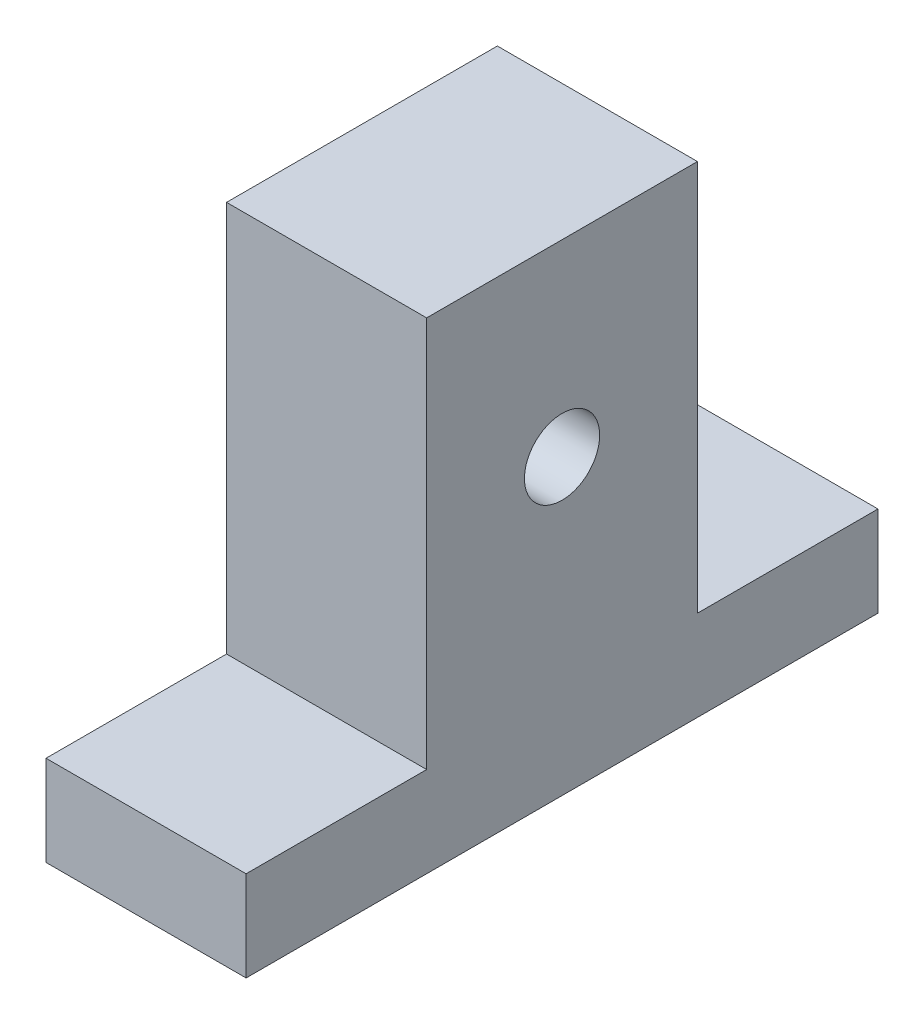
ISO-10303-21;
HEADER;
FILE_DESCRIPTION(('STEP AP214'),'2;1');
FILE_NAME('part.step','',(''),(''),'','','');
FILE_SCHEMA(('AUTOMOTIVE_DESIGN { 1 0 10303 214 1 1 1 1 }'));
ENDSEC;
DATA;
#1=APPLICATION_CONTEXT('core data for automotive mechanical design processes');
#2=APPLICATION_PROTOCOL_DEFINITION('international standard','automotive_design',2000,#1);
#3=PRODUCT_CONTEXT('',#1,'mechanical');
#4=PRODUCT('Part','Part','',(#3));
#5=PRODUCT_RELATED_PRODUCT_CATEGORY('part','',(#4));
#6=PRODUCT_DEFINITION_FORMATION('','',#4);
#7=PRODUCT_DEFINITION_CONTEXT('part definition',#1,'design');
#8=PRODUCT_DEFINITION('design','',#6,#7);
#9=PRODUCT_DEFINITION_SHAPE('','',#8);
#10=(LENGTH_UNIT() NAMED_UNIT(*) SI_UNIT(.MILLI.,.METRE.));
#11=(NAMED_UNIT(*) PLANE_ANGLE_UNIT() SI_UNIT($,.RADIAN.));
#12=(NAMED_UNIT(*) SI_UNIT($,.STERADIAN.) SOLID_ANGLE_UNIT());
#13=UNCERTAINTY_MEASURE_WITH_UNIT(LENGTH_MEASURE(1.E-05),#10,'distance_accuracy_value','');
#14=(GEOMETRIC_REPRESENTATION_CONTEXT(3) GLOBAL_UNCERTAINTY_ASSIGNED_CONTEXT((#13)) GLOBAL_UNIT_ASSIGNED_CONTEXT((#10,
#11,#12)) REPRESENTATION_CONTEXT('',''));
#15=CARTESIAN_POINT('',(0.,0.,0.));
#16=DIRECTION('',(0.,0.,1.));
#17=DIRECTION('',(1.,0.,0.));
#18=AXIS2_PLACEMENT_3D('',#15,#16,#17);
#19=CARTESIAN_POINT('',(13.3,0.,0.));
#20=DIRECTION('',(1.,0.,0.));
#21=DIRECTION('',(0.,0.,-1.));
#22=AXIS2_PLACEMENT_3D('',#19,#20,#21);
#23=PLANE('',#22);
#24=DIRECTION('',(0.,-1.,0.));
#25=VECTOR('',#24,1.);
#26=CARTESIAN_POINT('',(13.3,-84.4346273183229,73.8395149534096));
#27=LINE('',#26,#25);
#28=CARTESIAN_POINT('',(13.3,-84.4346273183229,73.8395149534096));
#29=VERTEX_POINT('',#28);
#30=CARTESIAN_POINT('',(13.3,-90.4346273183229,73.8395149534096));
#31=VERTEX_POINT('',#30);
#32=EDGE_CURVE('E153',#29,#31,#27,.T.);
#33=ORIENTED_EDGE('',*,*,#32,.T.);
#34=DIRECTION('',(0.,0.,-1.));
#35=VECTOR('',#34,1.);
#36=CARTESIAN_POINT('',(13.3,-90.4346273183229,73.8395149534096));
#37=LINE('',#36,#35);
#38=CARTESIAN_POINT('',(13.3,-90.4346273183229,31.8395149534096));
#39=VERTEX_POINT('',#38);
#40=EDGE_CURVE('E101',#31,#39,#37,.T.);
#41=ORIENTED_EDGE('',*,*,#40,.T.);
#42=DIRECTION('',(0.,1.,0.));
#43=VECTOR('',#42,1.);
#44=CARTESIAN_POINT('',(13.3,-90.4346273183229,31.8395149534096));
#45=LINE('',#44,#43);
#46=CARTESIAN_POINT('',(13.3,-84.4346273183229,31.8395149534096));
#47=VERTEX_POINT('',#46);
#48=EDGE_CURVE('E169',#39,#47,#45,.T.);
#49=ORIENTED_EDGE('',*,*,#48,.T.);
#50=DIRECTION('',(0.,0.,1.));
#51=VECTOR('',#50,1.);
#52=CARTESIAN_POINT('',(13.3,-84.4346273183229,31.8395149534096));
#53=LINE('',#52,#51);
#54=CARTESIAN_POINT('',(13.3,-84.4346273183229,43.8395149534096));
#55=VERTEX_POINT('',#54);
#56=EDGE_CURVE('E182',#47,#55,#53,.T.);
#57=ORIENTED_EDGE('',*,*,#56,.T.);
#58=DIRECTION('',(0.,1.,0.));
#59=VECTOR('',#58,1.);
#60=CARTESIAN_POINT('',(13.3,-84.4346273183229,43.8395149534096));
#61=LINE('',#60,#59);
#62=CARTESIAN_POINT('',(13.3,-58.4346273183229,43.8395149534096));
#63=VERTEX_POINT('',#62);
#64=EDGE_CURVE('E116',#55,#63,#61,.T.);
#65=ORIENTED_EDGE('',*,*,#64,.T.);
#66=DIRECTION('',(0.,0.,1.));
#67=VECTOR('',#66,1.);
#68=CARTESIAN_POINT('',(13.3,-58.4346273183229,43.8395149534096));
#69=LINE('',#68,#67);
#70=CARTESIAN_POINT('',(13.3,-58.4346273183229,61.8395149534097));
#71=VERTEX_POINT('',#70);
#72=EDGE_CURVE('E111',#63,#71,#69,.T.);
#73=ORIENTED_EDGE('',*,*,#72,.T.);
#74=DIRECTION('',(0.,-1.,0.));
#75=VECTOR('',#74,1.);
#76=CARTESIAN_POINT('',(13.3,-58.4346273183229,61.8395149534097));
#77=LINE('',#76,#75);
#78=CARTESIAN_POINT('',(13.3,-84.4346273183229,61.8395149534097));
#79=VERTEX_POINT('',#78);
#80=EDGE_CURVE('E117',#71,#79,#77,.T.);
#81=ORIENTED_EDGE('',*,*,#80,.T.);
#82=DIRECTION('',(0.,0.,1.));
#83=VECTOR('',#82,1.);
#84=CARTESIAN_POINT('',(13.3,-84.4346273183229,61.8395149534097));
#85=LINE('',#84,#83);
#86=EDGE_CURVE('E59',#79,#29,#85,.T.);
#87=ORIENTED_EDGE('',*,*,#86,.T.);
#88=EDGE_LOOP('',(#33,#41,#49,#57,#65,#73,#81,#87));
#89=FACE_BOUND('',#88,.T.);
#90=CARTESIAN_POINT('',(13.3,-70.9346273183229,52.8395149534096));
#91=DIRECTION('',(1.,0.,0.));
#92=DIRECTION('',(0.,0.,-1.));
#93=AXIS2_PLACEMENT_3D('',#90,#91,#92);
#94=CIRCLE('',#93,2.5);
#95=CARTESIAN_POINT('',(13.3,-70.9346273183229,50.3395149534096));
#96=VERTEX_POINT('',#95);
#97=EDGE_CURVE('E142',#96,#96,#94,.T.);
#98=ORIENTED_EDGE('',*,*,#97,.F.);
#99=EDGE_LOOP('',(#98));
#100=FACE_BOUND('',#99,.T.);
#101=ADVANCED_FACE('F41',(#89,#100),#23,.T.);
#102=CARTESIAN_POINT('',(0.,0.,0.));
#103=DIRECTION('',(1.,0.,0.));
#104=DIRECTION('',(0.,0.,-1.));
#105=AXIS2_PLACEMENT_3D('',#102,#103,#104);
#106=PLANE('',#105);
#107=DIRECTION('',(0.,-1.,0.));
#108=VECTOR('',#107,1.);
#109=CARTESIAN_POINT('',(0.,-84.4346273183229,73.8395149534096));
#110=LINE('',#109,#108);
#111=CARTESIAN_POINT('',(0.,-84.4346273183229,73.8395149534096));
#112=VERTEX_POINT('',#111);
#113=CARTESIAN_POINT('',(0.,-90.4346273183229,73.8395149534096));
#114=VERTEX_POINT('',#113);
#115=EDGE_CURVE('E138',#112,#114,#110,.T.);
#116=ORIENTED_EDGE('',*,*,#115,.F.);
#117=DIRECTION('',(0.,0.,1.));
#118=VECTOR('',#117,1.);
#119=CARTESIAN_POINT('',(0.,-84.4346273183229,61.8395149534097));
#120=LINE('',#119,#118);
#121=CARTESIAN_POINT('',(0.,-84.4346273183229,61.8395149534097));
#122=VERTEX_POINT('',#121);
#123=EDGE_CURVE('E91',#122,#112,#120,.T.);
#124=ORIENTED_EDGE('',*,*,#123,.F.);
#125=DIRECTION('',(0.,-1.,0.));
#126=VECTOR('',#125,1.);
#127=CARTESIAN_POINT('',(0.,-58.4346273183229,61.8395149534097));
#128=LINE('',#127,#126);
#129=CARTESIAN_POINT('',(0.,-58.4346273183229,61.8395149534097));
#130=VERTEX_POINT('',#129);
#131=EDGE_CURVE('E87',#130,#122,#128,.T.);
#132=ORIENTED_EDGE('',*,*,#131,.F.);
#133=DIRECTION('',(0.,0.,1.));
#134=VECTOR('',#133,1.);
#135=CARTESIAN_POINT('',(0.,-58.4346273183229,43.8395149534096));
#136=LINE('',#135,#134);
#137=CARTESIAN_POINT('',(0.,-58.4346273183229,43.8395149534096));
#138=VERTEX_POINT('',#137);
#139=EDGE_CURVE('E126',#138,#130,#136,.T.);
#140=ORIENTED_EDGE('',*,*,#139,.F.);
#141=DIRECTION('',(0.,1.,0.));
#142=VECTOR('',#141,1.);
#143=CARTESIAN_POINT('',(0.,-84.4346273183229,43.8395149534096));
#144=LINE('',#143,#142);
#145=CARTESIAN_POINT('',(0.,-84.4346273183229,43.8395149534096));
#146=VERTEX_POINT('',#145);
#147=EDGE_CURVE('E146',#146,#138,#144,.T.);
#148=ORIENTED_EDGE('',*,*,#147,.F.);
#149=DIRECTION('',(0.,0.,1.));
#150=VECTOR('',#149,1.);
#151=CARTESIAN_POINT('',(0.,-84.4346273183229,31.8395149534096));
#152=LINE('',#151,#150);
#153=CARTESIAN_POINT('',(0.,-84.4346273183229,31.8395149534096));
#154=VERTEX_POINT('',#153);
#155=EDGE_CURVE('E148',#154,#146,#152,.T.);
#156=ORIENTED_EDGE('',*,*,#155,.F.);
#157=DIRECTION('',(0.,1.,0.));
#158=VECTOR('',#157,1.);
#159=CARTESIAN_POINT('',(0.,-90.4346273183229,31.8395149534096));
#160=LINE('',#159,#158);
#161=CARTESIAN_POINT('',(0.,-90.4346273183229,31.8395149534096));
#162=VERTEX_POINT('',#161);
#163=EDGE_CURVE('E145',#162,#154,#160,.T.);
#164=ORIENTED_EDGE('',*,*,#163,.F.);
#165=DIRECTION('',(0.,0.,-1.));
#166=VECTOR('',#165,1.);
#167=CARTESIAN_POINT('',(0.,-90.4346273183229,73.8395149534096));
#168=LINE('',#167,#166);
#169=EDGE_CURVE('E143',#114,#162,#168,.T.);
#170=ORIENTED_EDGE('',*,*,#169,.F.);
#171=EDGE_LOOP('',(#116,#124,#132,#140,#148,#156,#164,#170));
#172=FACE_BOUND('',#171,.T.);
#173=CARTESIAN_POINT('',(0.,-70.9346273183229,52.8395149534096));
#174=DIRECTION('',(1.,0.,0.));
#175=DIRECTION('',(0.,0.,-1.));
#176=AXIS2_PLACEMENT_3D('',#173,#174,#175);
#177=CIRCLE('',#176,2.5);
#178=CARTESIAN_POINT('',(0.,-70.9346273183229,50.3395149534096));
#179=VERTEX_POINT('',#178);
#180=EDGE_CURVE('E190',#179,#179,#177,.T.);
#181=ORIENTED_EDGE('',*,*,#180,.T.);
#182=EDGE_LOOP('',(#181));
#183=FACE_BOUND('',#182,.T.);
#184=ADVANCED_FACE('F174',(#172,#183),#106,.F.);
#185=CARTESIAN_POINT('',(13.3,-84.4346273183229,73.8395149534096));
#186=DIRECTION('',(0.,0.,-1.));
#187=DIRECTION('',(-1.,0.,0.));
#188=AXIS2_PLACEMENT_3D('',#185,#186,#187);
#189=PLANE('',#188);
#190=ORIENTED_EDGE('',*,*,#115,.T.);
#191=DIRECTION('',(-1.,0.,0.));
#192=VECTOR('',#191,1.);
#193=CARTESIAN_POINT('',(13.3,-90.4346273183229,73.8395149534096));
#194=LINE('',#193,#192);
#195=EDGE_CURVE('E11',#31,#114,#194,.T.);
#196=ORIENTED_EDGE('',*,*,#195,.F.);
#197=ORIENTED_EDGE('',*,*,#32,.F.);
#198=DIRECTION('',(-1.,0.,0.));
#199=VECTOR('',#198,1.);
#200=CARTESIAN_POINT('',(13.3,-84.4346273183229,73.8395149534096));
#201=LINE('',#200,#199);
#202=EDGE_CURVE('E133',#29,#112,#201,.T.);
#203=ORIENTED_EDGE('',*,*,#202,.T.);
#204=EDGE_LOOP('',(#190,#196,#197,#203));
#205=FACE_BOUND('',#204,.T.);
#206=ADVANCED_FACE('F43',(#205),#189,.F.);
#207=CARTESIAN_POINT('',(13.3,-90.4346273183229,73.8395149534096));
#208=DIRECTION('',(0.,1.,0.));
#209=DIRECTION('',(0.,0.,1.));
#210=AXIS2_PLACEMENT_3D('',#207,#208,#209);
#211=PLANE('',#210);
#212=ORIENTED_EDGE('',*,*,#169,.T.);
#213=DIRECTION('',(-1.,0.,0.));
#214=VECTOR('',#213,1.);
#215=CARTESIAN_POINT('',(13.3,-90.4346273183229,31.8395149534096));
#216=LINE('',#215,#214);
#217=EDGE_CURVE('E49',#39,#162,#216,.T.);
#218=ORIENTED_EDGE('',*,*,#217,.F.);
#219=ORIENTED_EDGE('',*,*,#40,.F.);
#220=ORIENTED_EDGE('',*,*,#195,.T.);
#221=EDGE_LOOP('',(#212,#218,#219,#220));
#222=FACE_BOUND('',#221,.T.);
#223=ADVANCED_FACE('F214',(#222),#211,.F.);
#224=CARTESIAN_POINT('',(13.3,-90.4346273183229,31.8395149534096));
#225=DIRECTION('',(0.,0.,1.));
#226=DIRECTION('',(1.,0.,0.));
#227=AXIS2_PLACEMENT_3D('',#224,#225,#226);
#228=PLANE('',#227);
#229=ORIENTED_EDGE('',*,*,#163,.T.);
#230=DIRECTION('',(-1.,0.,0.));
#231=VECTOR('',#230,1.);
#232=CARTESIAN_POINT('',(13.3,-84.4346273183229,31.8395149534096));
#233=LINE('',#232,#231);
#234=EDGE_CURVE('E159',#47,#154,#233,.T.);
#235=ORIENTED_EDGE('',*,*,#234,.F.);
#236=ORIENTED_EDGE('',*,*,#48,.F.);
#237=ORIENTED_EDGE('',*,*,#217,.T.);
#238=EDGE_LOOP('',(#229,#235,#236,#237));
#239=FACE_BOUND('',#238,.T.);
#240=ADVANCED_FACE('F167',(#239),#228,.F.);
#241=CARTESIAN_POINT('',(13.3,-84.4346273183229,31.8395149534096));
#242=DIRECTION('',(0.,-1.,0.));
#243=DIRECTION('',(0.,0.,-1.));
#244=AXIS2_PLACEMENT_3D('',#241,#242,#243);
#245=PLANE('',#244);
#246=ORIENTED_EDGE('',*,*,#155,.T.);
#247=DIRECTION('',(-1.,0.,0.));
#248=VECTOR('',#247,1.);
#249=CARTESIAN_POINT('',(13.3,-84.4346273183229,43.8395149534096));
#250=LINE('',#249,#248);
#251=EDGE_CURVE('E160',#55,#146,#250,.T.);
#252=ORIENTED_EDGE('',*,*,#251,.F.);
#253=ORIENTED_EDGE('',*,*,#56,.F.);
#254=ORIENTED_EDGE('',*,*,#234,.T.);
#255=EDGE_LOOP('',(#246,#252,#253,#254));
#256=FACE_BOUND('',#255,.T.);
#257=ADVANCED_FACE('F180',(#256),#245,.F.);
#258=CARTESIAN_POINT('',(13.3,-84.4346273183229,43.8395149534096));
#259=DIRECTION('',(0.,0.,1.));
#260=DIRECTION('',(1.,0.,0.));
#261=AXIS2_PLACEMENT_3D('',#258,#259,#260);
#262=PLANE('',#261);
#263=ORIENTED_EDGE('',*,*,#147,.T.);
#264=DIRECTION('',(-1.,0.,0.));
#265=VECTOR('',#264,1.);
#266=CARTESIAN_POINT('',(13.3,-58.4346273183229,43.8395149534096));
#267=LINE('',#266,#265);
#268=EDGE_CURVE('E129',#63,#138,#267,.T.);
#269=ORIENTED_EDGE('',*,*,#268,.F.);
#270=ORIENTED_EDGE('',*,*,#64,.F.);
#271=ORIENTED_EDGE('',*,*,#251,.T.);
#272=EDGE_LOOP('',(#263,#269,#270,#271));
#273=FACE_BOUND('',#272,.T.);
#274=ADVANCED_FACE('F179',(#273),#262,.F.);
#275=CARTESIAN_POINT('',(13.3,-58.4346273183229,43.8395149534096));
#276=DIRECTION('',(0.,-1.,0.));
#277=DIRECTION('',(0.,0.,-1.));
#278=AXIS2_PLACEMENT_3D('',#275,#276,#277);
#279=PLANE('',#278);
#280=ORIENTED_EDGE('',*,*,#139,.T.);
#281=DIRECTION('',(-1.,0.,0.));
#282=VECTOR('',#281,1.);
#283=CARTESIAN_POINT('',(13.3,-58.4346273183229,61.8395149534097));
#284=LINE('',#283,#282);
#285=EDGE_CURVE('E124',#71,#130,#284,.T.);
#286=ORIENTED_EDGE('',*,*,#285,.F.);
#287=ORIENTED_EDGE('',*,*,#72,.F.);
#288=ORIENTED_EDGE('',*,*,#268,.T.);
#289=EDGE_LOOP('',(#280,#286,#287,#288));
#290=FACE_BOUND('',#289,.T.);
#291=ADVANCED_FACE('F127',(#290),#279,.F.);
#292=CARTESIAN_POINT('',(13.3,-58.4346273183229,61.8395149534097));
#293=DIRECTION('',(0.,0.,-1.));
#294=DIRECTION('',(0.,1.,0.));
#295=AXIS2_PLACEMENT_3D('',#292,#293,#294);
#296=PLANE('',#295);
#297=ORIENTED_EDGE('',*,*,#131,.T.);
#298=DIRECTION('',(-1.,0.,0.));
#299=VECTOR('',#298,1.);
#300=CARTESIAN_POINT('',(13.3,-84.4346273183229,61.8395149534097));
#301=LINE('',#300,#299);
#302=EDGE_CURVE('E128',#79,#122,#301,.T.);
#303=ORIENTED_EDGE('',*,*,#302,.F.);
#304=ORIENTED_EDGE('',*,*,#80,.F.);
#305=ORIENTED_EDGE('',*,*,#285,.T.);
#306=EDGE_LOOP('',(#297,#303,#304,#305));
#307=FACE_BOUND('',#306,.T.);
#308=ADVANCED_FACE('F135',(#307),#296,.F.);
#309=CARTESIAN_POINT('',(13.3,-84.4346273183229,61.8395149534097));
#310=DIRECTION('',(0.,-1.,0.));
#311=DIRECTION('',(0.,0.,-1.));
#312=AXIS2_PLACEMENT_3D('',#309,#310,#311);
#313=PLANE('',#312);
#314=ORIENTED_EDGE('',*,*,#123,.T.);
#315=ORIENTED_EDGE('',*,*,#202,.F.);
#316=ORIENTED_EDGE('',*,*,#86,.F.);
#317=ORIENTED_EDGE('',*,*,#302,.T.);
#318=EDGE_LOOP('',(#314,#315,#316,#317));
#319=FACE_BOUND('',#318,.T.);
#320=ADVANCED_FACE('F201',(#319),#313,.F.);
#321=CARTESIAN_POINT('',(13.3,-70.9346273183229,52.8395149534096));
#322=DIRECTION('',(-1.,0.,0.));
#323=DIRECTION('',(0.,0.,1.));
#324=AXIS2_PLACEMENT_3D('',#321,#322,#323);
#325=CYLINDRICAL_SURFACE('',#324,2.5);
#326=ORIENTED_EDGE('',*,*,#97,.T.);
#327=EDGE_LOOP('',(#326));
#328=FACE_BOUND('',#327,.T.);
#329=ORIENTED_EDGE('',*,*,#180,.F.);
#330=EDGE_LOOP('',(#329));
#331=FACE_BOUND('',#330,.T.);
#332=ADVANCED_FACE('F193',(#328,#331),#325,.F.);
#333=CLOSED_SHELL('',(#101,#184,#206,#223,#240,#257,#274,#291,#308,#320,#332));
#334=MANIFOLD_SOLID_BREP('B2',#333);
#335=ADVANCED_BREP_SHAPE_REPRESENTATION('',(#18,#334),#14);
#336=SHAPE_DEFINITION_REPRESENTATION(#9,#335);
ENDSEC;
END-ISO-10303-21;
